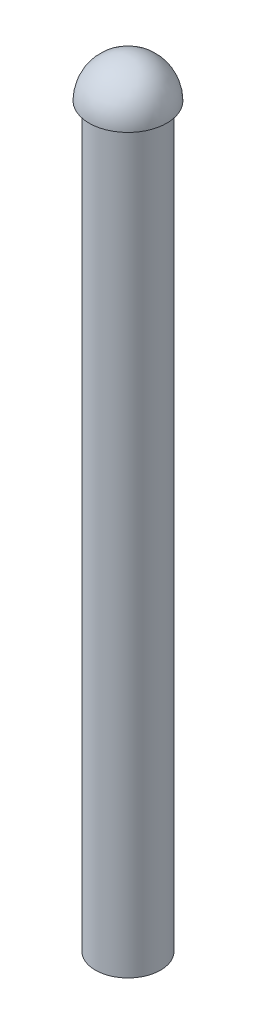
ISO-10303-21;
HEADER;
FILE_DESCRIPTION(('STEP AP214'),'2;1');
FILE_NAME('part.step','',(''),(''),'','','');
FILE_SCHEMA(('AUTOMOTIVE_DESIGN { 1 0 10303 214 1 1 1 1 }'));
ENDSEC;
DATA;
#1=APPLICATION_CONTEXT('core data for automotive mechanical design processes');
#2=APPLICATION_PROTOCOL_DEFINITION('international standard','automotive_design',2000,#1);
#3=PRODUCT_CONTEXT('',#1,'mechanical');
#4=PRODUCT('Part','Part','',(#3));
#5=PRODUCT_RELATED_PRODUCT_CATEGORY('part','',(#4));
#6=PRODUCT_DEFINITION_FORMATION('','',#4);
#7=PRODUCT_DEFINITION_CONTEXT('part definition',#1,'design');
#8=PRODUCT_DEFINITION('design','',#6,#7);
#9=PRODUCT_DEFINITION_SHAPE('','',#8);
#10=(LENGTH_UNIT() NAMED_UNIT(*) SI_UNIT(.MILLI.,.METRE.));
#11=(NAMED_UNIT(*) PLANE_ANGLE_UNIT() SI_UNIT($,.RADIAN.));
#12=(NAMED_UNIT(*) SI_UNIT($,.STERADIAN.) SOLID_ANGLE_UNIT());
#13=UNCERTAINTY_MEASURE_WITH_UNIT(LENGTH_MEASURE(1.E-05),#10,'distance_accuracy_value','');
#14=(GEOMETRIC_REPRESENTATION_CONTEXT(3) GLOBAL_UNCERTAINTY_ASSIGNED_CONTEXT((#13)) GLOBAL_UNIT_ASSIGNED_CONTEXT((#10,
#11,#12)) REPRESENTATION_CONTEXT('',''));
#15=CARTESIAN_POINT('',(0.,0.,0.));
#16=DIRECTION('',(0.,0.,1.));
#17=DIRECTION('',(1.,0.,0.));
#18=AXIS2_PLACEMENT_3D('',#15,#16,#17);
#19=CARTESIAN_POINT('',(0.,0.,0.));
#20=DIRECTION('',(0.,0.,-1.));
#21=DIRECTION('',(-1.,0.,0.));
#22=AXIS2_PLACEMENT_3D('',#19,#20,#21);
#23=SPHERICAL_SURFACE('',#22,7.75);
#24=CARTESIAN_POINT('',(0.,0.,0.));
#25=DIRECTION('',(0.,-1.,0.));
#26=DIRECTION('',(0.,0.,1.));
#27=AXIS2_PLACEMENT_3D('',#24,#25,#26);
#28=SPHERICAL_SURFACE('',#27,7.75);
#29=CARTESIAN_POINT('',(0.,0.,0.));
#30=DIRECTION('',(0.,-1.,0.));
#31=DIRECTION('',(0.,0.,1.));
#32=AXIS2_PLACEMENT_3D('',#29,#30,#31);
#33=CIRCLE('',#32,7.75);
#34=CARTESIAN_POINT('',(0.,0.,7.75));
#35=VERTEX_POINT('',#34);
#36=EDGE_CURVE('E11',#35,#35,#33,.T.);
#37=ORIENTED_EDGE('',*,*,#36,.F.);
#38=EDGE_LOOP('',(#37));
#39=FACE_BOUND('',#38,.T.);
#40=ADVANCED_FACE('F53',(#39),#28,.T.);
#41=CARTESIAN_POINT('',(0.,0.,0.));
#42=DIRECTION('',(0.,-1.,0.));
#43=DIRECTION('',(0.,0.,1.));
#44=AXIS2_PLACEMENT_3D('',#41,#42,#43);
#45=PLANE('',#44);
#46=CARTESIAN_POINT('',(0.,0.,0.));
#47=DIRECTION('',(0.,1.,0.));
#48=DIRECTION('',(0.,0.,1.));
#49=AXIS2_PLACEMENT_3D('',#46,#47,#48);
#50=CIRCLE('',#49,6.5);
#51=CARTESIAN_POINT('',(0.,0.,6.5));
#52=VERTEX_POINT('',#51);
#53=EDGE_CURVE('E74',#52,#52,#50,.T.);
#54=ORIENTED_EDGE('',*,*,#53,.T.);
#55=EDGE_LOOP('',(#54));
#56=FACE_BOUND('',#55,.T.);
#57=ORIENTED_EDGE('',*,*,#36,.T.);
#58=EDGE_LOOP('',(#57));
#59=FACE_BOUND('',#58,.T.);
#60=ADVANCED_FACE('F95',(#56,#59),#45,.T.);
#61=CARTESIAN_POINT('',(0.,-146.9,0.));
#62=DIRECTION('',(0.,1.,0.));
#63=DIRECTION('',(0.,0.,1.));
#64=AXIS2_PLACEMENT_3D('',#61,#62,#63);
#65=PLANE('',#64);
#66=CARTESIAN_POINT('',(0.,-146.9,0.));
#67=DIRECTION('',(0.,-1.,0.));
#68=DIRECTION('',(0.,0.,-1.));
#69=AXIS2_PLACEMENT_3D('',#66,#67,#68);
#70=CIRCLE('',#69,4.025);
#71=CARTESIAN_POINT('',(0.,-146.9,-4.02500000000004));
#72=VERTEX_POINT('',#71);
#73=EDGE_CURVE('E84',#72,#72,#70,.T.);
#74=ORIENTED_EDGE('',*,*,#73,.F.);
#75=EDGE_LOOP('',(#74));
#76=FACE_BOUND('',#75,.T.);
#77=CARTESIAN_POINT('',(0.,-146.9,0.));
#78=DIRECTION('',(0.,1.,0.));
#79=DIRECTION('',(0.,0.,1.));
#80=AXIS2_PLACEMENT_3D('',#77,#78,#79);
#81=CIRCLE('',#80,6.5);
#82=CARTESIAN_POINT('',(0.,-146.9,6.49999999999996));
#83=VERTEX_POINT('',#82);
#84=EDGE_CURVE('E60',#83,#83,#81,.T.);
#85=ORIENTED_EDGE('',*,*,#84,.F.);
#86=EDGE_LOOP('',(#85));
#87=FACE_BOUND('',#86,.T.);
#88=ADVANCED_FACE('F93',(#76,#87),#65,.F.);
#89=CARTESIAN_POINT('',(0.,0.,0.));
#90=DIRECTION('',(0.,1.,0.));
#91=DIRECTION('',(0.,0.,1.));
#92=AXIS2_PLACEMENT_3D('',#89,#90,#91);
#93=CYLINDRICAL_SURFACE('',#92,6.5);
#94=ORIENTED_EDGE('',*,*,#53,.F.);
#95=EDGE_LOOP('',(#94));
#96=FACE_BOUND('',#95,.T.);
#97=ORIENTED_EDGE('',*,*,#84,.T.);
#98=EDGE_LOOP('',(#97));
#99=FACE_BOUND('',#98,.T.);
#100=ADVANCED_FACE('F67',(#96,#99),#93,.T.);
#101=CARTESIAN_POINT('',(0.,-127.15,0.));
#102=DIRECTION('',(0.,-1.,0.));
#103=DIRECTION('',(0.,0.,-1.));
#104=AXIS2_PLACEMENT_3D('',#101,#102,#103);
#105=CONICAL_SURFACE('',#104,3.4,1.02974425867665);
#106=CARTESIAN_POINT('',(0.,-125.107073895306,0.));
#107=VERTEX_POINT('',#106);
#108=VERTEX_LOOP('',#107);
#109=FACE_BOUND('',#108,.T.);
#110=CARTESIAN_POINT('',(0.,-127.15,0.));
#111=DIRECTION('',(0.,-1.,0.));
#112=DIRECTION('',(0.,0.,-1.));
#113=AXIS2_PLACEMENT_3D('',#110,#111,#112);
#114=CIRCLE('',#113,3.4);
#115=CARTESIAN_POINT('',(0.,-127.15,-3.40000000000004));
#116=VERTEX_POINT('',#115);
#117=EDGE_CURVE('E71',#116,#116,#114,.T.);
#118=ORIENTED_EDGE('',*,*,#117,.T.);
#119=EDGE_LOOP('',(#118));
#120=FACE_BOUND('',#119,.T.);
#121=ADVANCED_FACE('F63',(#109,#120),#105,.F.);
#122=CARTESIAN_POINT('',(0.,-146.9,0.));
#123=DIRECTION('',(0.,-1.,0.));
#124=DIRECTION('',(0.,0.,-1.));
#125=AXIS2_PLACEMENT_3D('',#122,#123,#124);
#126=CYLINDRICAL_SURFACE('',#125,3.4);
#127=ORIENTED_EDGE('',*,*,#117,.F.);
#128=EDGE_LOOP('',(#127));
#129=FACE_BOUND('',#128,.T.);
#130=CARTESIAN_POINT('',(0.,-146.275,0.));
#131=DIRECTION('',(0.,-1.,0.));
#132=DIRECTION('',(0.,0.,-1.));
#133=AXIS2_PLACEMENT_3D('',#130,#131,#132);
#134=CIRCLE('',#133,3.4);
#135=CARTESIAN_POINT('',(0.,-146.275,-3.40000000000004));
#136=VERTEX_POINT('',#135);
#137=EDGE_CURVE('E75',#136,#136,#134,.T.);
#138=ORIENTED_EDGE('',*,*,#137,.T.);
#139=EDGE_LOOP('',(#138));
#140=FACE_BOUND('',#139,.T.);
#141=ADVANCED_FACE('F66',(#129,#140),#126,.F.);
#142=CARTESIAN_POINT('',(0.,-146.9,0.));
#143=DIRECTION('',(0.,-1.,0.));
#144=DIRECTION('',(0.,0.,-1.));
#145=AXIS2_PLACEMENT_3D('',#142,#143,#144);
#146=CONICAL_SURFACE('',#145,4.025,0.785398163397439);
#147=ORIENTED_EDGE('',*,*,#137,.F.);
#148=EDGE_LOOP('',(#147));
#149=FACE_BOUND('',#148,.T.);
#150=ORIENTED_EDGE('',*,*,#73,.T.);
#151=EDGE_LOOP('',(#150));
#152=FACE_BOUND('',#151,.T.);
#153=ADVANCED_FACE('F141',(#149,#152),#146,.F.);
#154=CLOSED_SHELL('',(#40,#60,#88,#100,#121,#141,#153));
#155=MANIFOLD_SOLID_BREP('B2',#154);
#156=ADVANCED_BREP_SHAPE_REPRESENTATION('',(#18,#155),#14);
#157=SHAPE_DEFINITION_REPRESENTATION(#9,#156);
ENDSEC;
END-ISO-10303-21;
